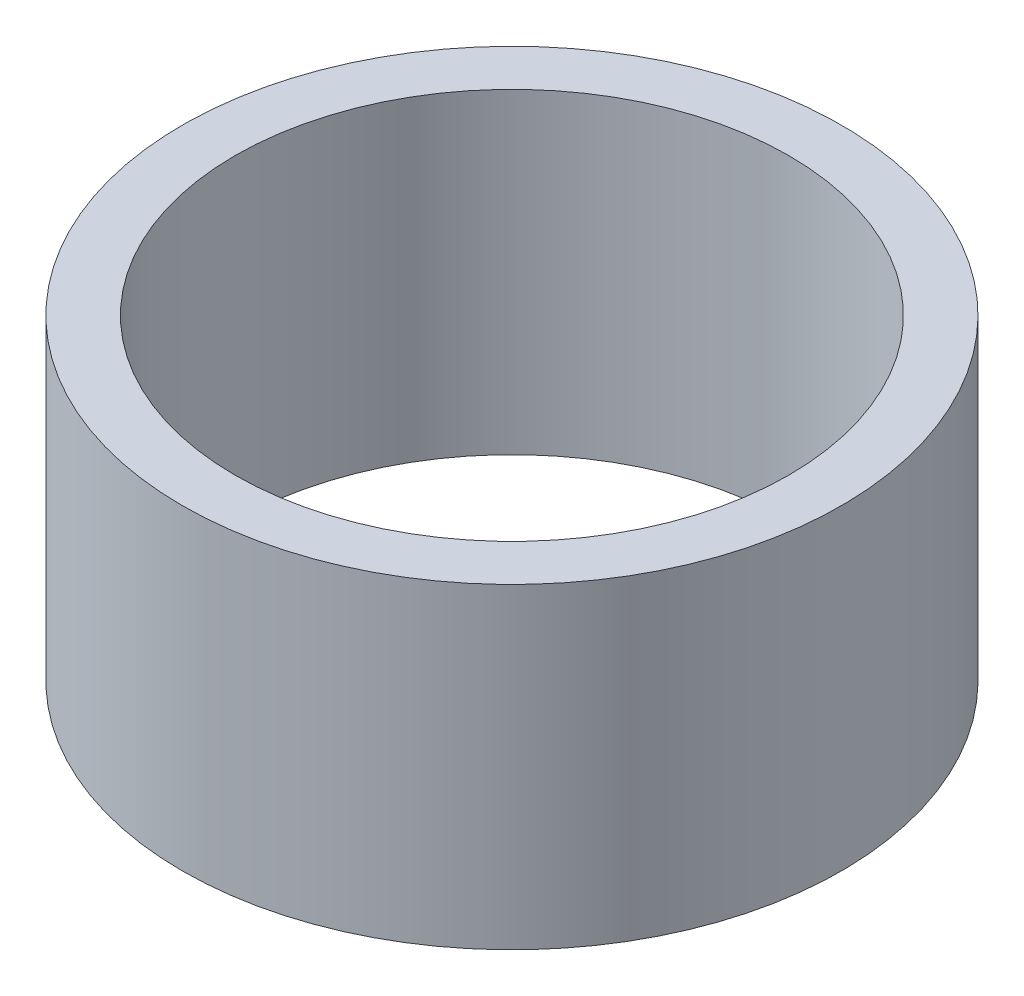
ISO-10303-21;
HEADER;
FILE_DESCRIPTION(('STEP AP214'),'2;1');
FILE_NAME('part.step','',(''),(''),'','','');
FILE_SCHEMA(('AUTOMOTIVE_DESIGN { 1 0 10303 214 1 1 1 1 }'));
ENDSEC;
DATA;
#1=APPLICATION_CONTEXT('core data for automotive mechanical design processes');
#2=APPLICATION_PROTOCOL_DEFINITION('international standard','automotive_design',2000,#1);
#3=PRODUCT_CONTEXT('',#1,'mechanical');
#4=PRODUCT('Part','Part','',(#3));
#5=PRODUCT_RELATED_PRODUCT_CATEGORY('part','',(#4));
#6=PRODUCT_DEFINITION_FORMATION('','',#4);
#7=PRODUCT_DEFINITION_CONTEXT('part definition',#1,'design');
#8=PRODUCT_DEFINITION('design','',#6,#7);
#9=PRODUCT_DEFINITION_SHAPE('','',#8);
#10=(LENGTH_UNIT() NAMED_UNIT(*) SI_UNIT(.MILLI.,.METRE.));
#11=(NAMED_UNIT(*) PLANE_ANGLE_UNIT() SI_UNIT($,.RADIAN.));
#12=(NAMED_UNIT(*) SI_UNIT($,.STERADIAN.) SOLID_ANGLE_UNIT());
#13=UNCERTAINTY_MEASURE_WITH_UNIT(LENGTH_MEASURE(1.E-05),#10,'distance_accuracy_value','');
#14=(GEOMETRIC_REPRESENTATION_CONTEXT(3) GLOBAL_UNCERTAINTY_ASSIGNED_CONTEXT((#13)) GLOBAL_UNIT_ASSIGNED_CONTEXT((#10,
#11,#12)) REPRESENTATION_CONTEXT('',''));
#15=CARTESIAN_POINT('',(0.,0.,0.));
#16=DIRECTION('',(0.,0.,1.));
#17=DIRECTION('',(1.,0.,0.));
#18=AXIS2_PLACEMENT_3D('',#15,#16,#17);
#19=CARTESIAN_POINT('',(0.,6.,0.));
#20=DIRECTION('',(0.,1.,0.));
#21=DIRECTION('',(0.,0.,1.));
#22=AXIS2_PLACEMENT_3D('',#19,#20,#21);
#23=PLANE('',#22);
#24=CARTESIAN_POINT('',(0.,6.,0.));
#25=DIRECTION('',(0.,1.,0.));
#26=DIRECTION('',(0.,0.,1.));
#27=AXIS2_PLACEMENT_3D('',#24,#25,#26);
#28=CIRCLE('',#27,6.25);
#29=CARTESIAN_POINT('',(0.,6.,6.25));
#30=VERTEX_POINT('',#29);
#31=EDGE_CURVE('E10',#30,#30,#28,.T.);
#32=ORIENTED_EDGE('',*,*,#31,.T.);
#33=EDGE_LOOP('',(#32));
#34=FACE_BOUND('',#33,.T.);
#35=CARTESIAN_POINT('',(0.,6.,0.));
#36=DIRECTION('',(0.,1.,0.));
#37=DIRECTION('',(0.,0.,1.));
#38=AXIS2_PLACEMENT_3D('',#35,#36,#37);
#39=CIRCLE('',#38,5.25);
#40=CARTESIAN_POINT('',(0.,6.,5.25));
#41=VERTEX_POINT('',#40);
#42=EDGE_CURVE('E44',#41,#41,#39,.T.);
#43=ORIENTED_EDGE('',*,*,#42,.F.);
#44=EDGE_LOOP('',(#43));
#45=FACE_BOUND('',#44,.T.);
#46=ADVANCED_FACE('F33',(#34,#45),#23,.T.);
#47=CARTESIAN_POINT('',(0.,0.,0.));
#48=DIRECTION('',(0.,1.,0.));
#49=DIRECTION('',(0.,0.,1.));
#50=AXIS2_PLACEMENT_3D('',#47,#48,#49);
#51=PLANE('',#50);
#52=CARTESIAN_POINT('',(0.,0.,0.));
#53=DIRECTION('',(0.,1.,0.));
#54=DIRECTION('',(0.,0.,1.));
#55=AXIS2_PLACEMENT_3D('',#52,#53,#54);
#56=CIRCLE('',#55,6.25);
#57=CARTESIAN_POINT('',(0.,0.,6.25));
#58=VERTEX_POINT('',#57);
#59=EDGE_CURVE('E37',#58,#58,#56,.T.);
#60=ORIENTED_EDGE('',*,*,#59,.F.);
#61=EDGE_LOOP('',(#60));
#62=FACE_BOUND('',#61,.T.);
#63=CARTESIAN_POINT('',(0.,0.,0.));
#64=DIRECTION('',(0.,1.,0.));
#65=DIRECTION('',(0.,0.,1.));
#66=AXIS2_PLACEMENT_3D('',#63,#64,#65);
#67=CIRCLE('',#66,5.25);
#68=CARTESIAN_POINT('',(0.,0.,5.25));
#69=VERTEX_POINT('',#68);
#70=EDGE_CURVE('E46',#69,#69,#67,.T.);
#71=ORIENTED_EDGE('',*,*,#70,.T.);
#72=EDGE_LOOP('',(#71));
#73=FACE_BOUND('',#72,.T.);
#74=ADVANCED_FACE('F56',(#62,#73),#51,.F.);
#75=CARTESIAN_POINT('',(0.,6.,0.));
#76=DIRECTION('',(0.,-1.,0.));
#77=DIRECTION('',(0.,0.,-1.));
#78=AXIS2_PLACEMENT_3D('',#75,#76,#77);
#79=CYLINDRICAL_SURFACE('',#78,6.25);
#80=ORIENTED_EDGE('',*,*,#31,.F.);
#81=EDGE_LOOP('',(#80));
#82=FACE_BOUND('',#81,.T.);
#83=ORIENTED_EDGE('',*,*,#59,.T.);
#84=EDGE_LOOP('',(#83));
#85=FACE_BOUND('',#84,.T.);
#86=ADVANCED_FACE('F35',(#82,#85),#79,.T.);
#87=CARTESIAN_POINT('',(0.,6.,0.));
#88=DIRECTION('',(0.,-1.,0.));
#89=DIRECTION('',(0.,0.,-1.));
#90=AXIS2_PLACEMENT_3D('',#87,#88,#89);
#91=CYLINDRICAL_SURFACE('',#90,5.25);
#92=ORIENTED_EDGE('',*,*,#42,.T.);
#93=EDGE_LOOP('',(#92));
#94=FACE_BOUND('',#93,.T.);
#95=ORIENTED_EDGE('',*,*,#70,.F.);
#96=EDGE_LOOP('',(#95));
#97=FACE_BOUND('',#96,.T.);
#98=ADVANCED_FACE('F52',(#94,#97),#91,.F.);
#99=CLOSED_SHELL('',(#46,#74,#86,#98));
#100=MANIFOLD_SOLID_BREP('B2',#99);
#101=ADVANCED_BREP_SHAPE_REPRESENTATION('',(#18,#100),#14);
#102=SHAPE_DEFINITION_REPRESENTATION(#9,#101);
ENDSEC;
END-ISO-10303-21;
